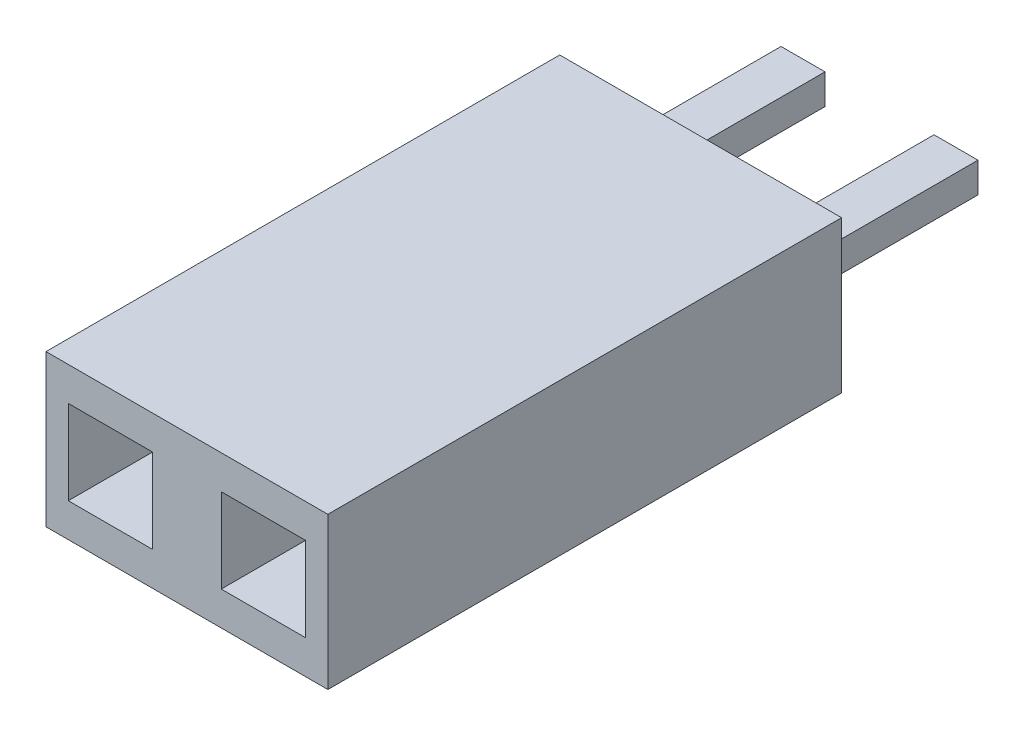
ISO-10303-21;
HEADER;
FILE_DESCRIPTION(('STEP AP214'),'2;1');
FILE_NAME('part.step','',(''),(''),'','','');
FILE_SCHEMA(('AUTOMOTIVE_DESIGN { 1 0 10303 214 1 1 1 1 }'));
ENDSEC;
DATA;
#1=APPLICATION_CONTEXT('core data for automotive mechanical design processes');
#2=APPLICATION_PROTOCOL_DEFINITION('international standard','automotive_design',2000,#1);
#3=PRODUCT_CONTEXT('',#1,'mechanical');
#4=PRODUCT('Part','Part','',(#3));
#5=PRODUCT_RELATED_PRODUCT_CATEGORY('part','',(#4));
#6=PRODUCT_DEFINITION_FORMATION('','',#4);
#7=PRODUCT_DEFINITION_CONTEXT('part definition',#1,'design');
#8=PRODUCT_DEFINITION('design','',#6,#7);
#9=PRODUCT_DEFINITION_SHAPE('','',#8);
#10=(LENGTH_UNIT() NAMED_UNIT(*) SI_UNIT(.MILLI.,.METRE.));
#11=(NAMED_UNIT(*) PLANE_ANGLE_UNIT() SI_UNIT($,.RADIAN.));
#12=(NAMED_UNIT(*) SI_UNIT($,.STERADIAN.) SOLID_ANGLE_UNIT());
#13=UNCERTAINTY_MEASURE_WITH_UNIT(LENGTH_MEASURE(1.E-05),#10,'distance_accuracy_value','');
#14=(GEOMETRIC_REPRESENTATION_CONTEXT(3) GLOBAL_UNCERTAINTY_ASSIGNED_CONTEXT((#13)) GLOBAL_UNIT_ASSIGNED_CONTEXT((#10,
#11,#12)) REPRESENTATION_CONTEXT('',''));
#15=CARTESIAN_POINT('',(0.,0.,0.));
#16=DIRECTION('',(0.,0.,1.));
#17=DIRECTION('',(1.,0.,0.));
#18=AXIS2_PLACEMENT_3D('',#15,#16,#17);
#19=CARTESIAN_POINT('',(-5.34952853598015,-1.31761786600496,8.53));
#20=DIRECTION('',(1.,0.,0.));
#21=DIRECTION('',(0.,0.,-1.));
#22=AXIS2_PLACEMENT_3D('',#19,#20,#21);
#23=PLANE('',#22);
#24=DIRECTION('',(0.,-1.,0.));
#25=VECTOR('',#24,1.);
#26=CARTESIAN_POINT('',(-5.34952853598015,-1.31761786600496,0.));
#27=LINE('',#26,#25);
#28=CARTESIAN_POINT('',(-5.34952853598015,1.20238213399504,0.));
#29=VERTEX_POINT('',#28);
#30=CARTESIAN_POINT('',(-5.34952853598015,-1.31761786600496,0.));
#31=VERTEX_POINT('',#30);
#32=EDGE_CURVE('E284',#29,#31,#27,.T.);
#33=ORIENTED_EDGE('',*,*,#32,.T.);
#34=DIRECTION('',(0.,0.,-1.));
#35=VECTOR('',#34,1.);
#36=CARTESIAN_POINT('',(-5.34952853598015,-1.31761786600496,8.53));
#37=LINE('',#36,#35);
#38=CARTESIAN_POINT('',(-5.34952853598015,-1.31761786600496,8.53));
#39=VERTEX_POINT('',#38);
#40=EDGE_CURVE('E317',#39,#31,#37,.T.);
#41=ORIENTED_EDGE('',*,*,#40,.F.);
#42=DIRECTION('',(0.,-1.,0.));
#43=VECTOR('',#42,1.);
#44=CARTESIAN_POINT('',(-5.34952853598015,-1.31761786600496,8.53));
#45=LINE('',#44,#43);
#46=CARTESIAN_POINT('',(-5.34952853598015,1.20238213399504,8.53));
#47=VERTEX_POINT('',#46);
#48=EDGE_CURVE('E291',#47,#39,#45,.T.);
#49=ORIENTED_EDGE('',*,*,#48,.F.);
#50=DIRECTION('',(0.,0.,-1.));
#51=VECTOR('',#50,1.);
#52=CARTESIAN_POINT('',(-5.34952853598015,1.20238213399504,8.53));
#53=LINE('',#52,#51);
#54=EDGE_CURVE('E301',#47,#29,#53,.T.);
#55=ORIENTED_EDGE('',*,*,#54,.T.);
#56=EDGE_LOOP('',(#33,#41,#49,#55));
#57=FACE_BOUND('',#56,.T.);
#58=ADVANCED_FACE('F36',(#57),#23,.F.);
#59=CARTESIAN_POINT('',(-0.669528535980149,-1.31761786600496,8.53));
#60=DIRECTION('',(0.,1.,0.));
#61=DIRECTION('',(0.,0.,1.));
#62=AXIS2_PLACEMENT_3D('',#59,#60,#61);
#63=PLANE('',#62);
#64=DIRECTION('',(1.,0.,0.));
#65=VECTOR('',#64,1.);
#66=CARTESIAN_POINT('',(-0.669528535980149,-1.31761786600496,0.));
#67=LINE('',#66,#65);
#68=CARTESIAN_POINT('',(-0.669528535980149,-1.31761786600496,0.));
#69=VERTEX_POINT('',#68);
#70=EDGE_CURVE('E304',#31,#69,#67,.T.);
#71=ORIENTED_EDGE('',*,*,#70,.T.);
#72=DIRECTION('',(0.,0.,-1.));
#73=VECTOR('',#72,1.);
#74=CARTESIAN_POINT('',(-0.669528535980149,-1.31761786600496,8.53));
#75=LINE('',#74,#73);
#76=CARTESIAN_POINT('',(-0.669528535980149,-1.31761786600496,8.53));
#77=VERTEX_POINT('',#76);
#78=EDGE_CURVE('E314',#77,#69,#75,.T.);
#79=ORIENTED_EDGE('',*,*,#78,.F.);
#80=DIRECTION('',(1.,0.,0.));
#81=VECTOR('',#80,1.);
#82=CARTESIAN_POINT('',(-0.669528535980149,-1.31761786600496,8.53));
#83=LINE('',#82,#81);
#84=EDGE_CURVE('E294',#39,#77,#83,.T.);
#85=ORIENTED_EDGE('',*,*,#84,.F.);
#86=ORIENTED_EDGE('',*,*,#40,.T.);
#87=EDGE_LOOP('',(#71,#79,#85,#86));
#88=FACE_BOUND('',#87,.T.);
#89=ADVANCED_FACE('F346',(#88),#63,.F.);
#90=CARTESIAN_POINT('',(-0.669528535980149,1.20238213399504,8.53));
#91=DIRECTION('',(-1.,0.,0.));
#92=DIRECTION('',(0.,0.,1.));
#93=AXIS2_PLACEMENT_3D('',#90,#91,#92);
#94=PLANE('',#93);
#95=DIRECTION('',(0.,1.,0.));
#96=VECTOR('',#95,1.);
#97=CARTESIAN_POINT('',(-0.669528535980149,1.20238213399504,0.));
#98=LINE('',#97,#96);
#99=CARTESIAN_POINT('',(-0.669528535980149,1.20238213399504,0.));
#100=VERTEX_POINT('',#99);
#101=EDGE_CURVE('E306',#69,#100,#98,.T.);
#102=ORIENTED_EDGE('',*,*,#101,.T.);
#103=DIRECTION('',(0.,0.,-1.));
#104=VECTOR('',#103,1.);
#105=CARTESIAN_POINT('',(-0.669528535980149,1.20238213399504,8.53));
#106=LINE('',#105,#104);
#107=CARTESIAN_POINT('',(-0.669528535980149,1.20238213399504,8.53));
#108=VERTEX_POINT('',#107);
#109=EDGE_CURVE('E311',#108,#100,#106,.T.);
#110=ORIENTED_EDGE('',*,*,#109,.F.);
#111=DIRECTION('',(0.,1.,0.));
#112=VECTOR('',#111,1.);
#113=CARTESIAN_POINT('',(-0.669528535980149,1.20238213399504,8.53));
#114=LINE('',#113,#112);
#115=EDGE_CURVE('E297',#77,#108,#114,.T.);
#116=ORIENTED_EDGE('',*,*,#115,.F.);
#117=ORIENTED_EDGE('',*,*,#78,.T.);
#118=EDGE_LOOP('',(#102,#110,#116,#117));
#119=FACE_BOUND('',#118,.T.);
#120=ADVANCED_FACE('F351',(#119),#94,.F.);
#121=CARTESIAN_POINT('',(-5.34952853598015,1.20238213399504,8.53));
#122=DIRECTION('',(0.,-1.,0.));
#123=DIRECTION('',(0.,0.,-1.));
#124=AXIS2_PLACEMENT_3D('',#121,#122,#123);
#125=PLANE('',#124);
#126=DIRECTION('',(-1.,0.,0.));
#127=VECTOR('',#126,1.);
#128=CARTESIAN_POINT('',(-5.34952853598015,1.20238213399504,0.));
#129=LINE('',#128,#127);
#130=EDGE_CURVE('E295',#100,#29,#129,.T.);
#131=ORIENTED_EDGE('',*,*,#130,.T.);
#132=ORIENTED_EDGE('',*,*,#54,.F.);
#133=DIRECTION('',(-1.,0.,0.));
#134=VECTOR('',#133,1.);
#135=CARTESIAN_POINT('',(-5.34952853598015,1.20238213399504,8.53));
#136=LINE('',#135,#134);
#137=EDGE_CURVE('E299',#108,#47,#136,.T.);
#138=ORIENTED_EDGE('',*,*,#137,.F.);
#139=ORIENTED_EDGE('',*,*,#109,.T.);
#140=EDGE_LOOP('',(#131,#132,#138,#139));
#141=FACE_BOUND('',#140,.T.);
#142=ADVANCED_FACE('F368',(#141),#125,.F.);
#143=CARTESIAN_POINT('',(0.,0.,8.53));
#144=DIRECTION('',(0.,0.,-1.));
#145=DIRECTION('',(-1.,0.,0.));
#146=AXIS2_PLACEMENT_3D('',#143,#144,#145);
#147=PLANE('',#146);
#148=DIRECTION('',(1.,0.,0.));
#149=VECTOR('',#148,1.);
#150=CARTESIAN_POINT('',(-3.57952853598015,-0.757617866004965,8.53));
#151=LINE('',#150,#149);
#152=CARTESIAN_POINT('',(-4.97952853598015,-0.757617866004965,8.53));
#153=VERTEX_POINT('',#152);
#154=CARTESIAN_POINT('',(-3.57952853598015,-0.757617866004965,8.53));
#155=VERTEX_POINT('',#154);
#156=EDGE_CURVE('E242',#153,#155,#151,.T.);
#157=ORIENTED_EDGE('',*,*,#156,.F.);
#158=DIRECTION('',(0.,-1.,0.));
#159=VECTOR('',#158,1.);
#160=CARTESIAN_POINT('',(-4.97952853598015,-0.757617866004965,8.53));
#161=LINE('',#160,#159);
#162=CARTESIAN_POINT('',(-4.97952853598015,0.642382133995035,8.53));
#163=VERTEX_POINT('',#162);
#164=EDGE_CURVE('E218',#163,#153,#161,.T.);
#165=ORIENTED_EDGE('',*,*,#164,.F.);
#166=DIRECTION('',(-1.,0.,0.));
#167=VECTOR('',#166,1.);
#168=CARTESIAN_POINT('',(-3.57952853598015,0.642382133995035,8.53));
#169=LINE('',#168,#167);
#170=CARTESIAN_POINT('',(-3.57952853598015,0.642382133995035,8.53));
#171=VERTEX_POINT('',#170);
#172=EDGE_CURVE('E231',#171,#163,#169,.T.);
#173=ORIENTED_EDGE('',*,*,#172,.F.);
#174=DIRECTION('',(0.,1.,0.));
#175=VECTOR('',#174,1.);
#176=CARTESIAN_POINT('',(-3.57952853598015,-0.757617866004965,8.53));
#177=LINE('',#176,#175);
#178=EDGE_CURVE('E245',#155,#171,#177,.T.);
#179=ORIENTED_EDGE('',*,*,#178,.F.);
#180=EDGE_LOOP('',(#157,#165,#173,#179));
#181=FACE_BOUND('',#180,.T.);
#182=DIRECTION('',(1.,0.,0.));
#183=VECTOR('',#182,1.);
#184=CARTESIAN_POINT('',(-1.03952853598015,-0.757617866004965,8.53));
#185=LINE('',#184,#183);
#186=CARTESIAN_POINT('',(-2.43952853598015,-0.757617866004965,8.53));
#187=VERTEX_POINT('',#186);
#188=CARTESIAN_POINT('',(-1.03952853598015,-0.757617866004965,8.53));
#189=VERTEX_POINT('',#188);
#190=EDGE_CURVE('E274',#187,#189,#185,.T.);
#191=ORIENTED_EDGE('',*,*,#190,.F.);
#192=DIRECTION('',(0.,-1.,0.));
#193=VECTOR('',#192,1.);
#194=CARTESIAN_POINT('',(-2.43952853598015,-0.757617866004965,8.53));
#195=LINE('',#194,#193);
#196=CARTESIAN_POINT('',(-2.43952853598015,0.642382133995035,8.53));
#197=VERTEX_POINT('',#196);
#198=EDGE_CURVE('E252',#197,#187,#195,.T.);
#199=ORIENTED_EDGE('',*,*,#198,.F.);
#200=DIRECTION('',(-1.,0.,0.));
#201=VECTOR('',#200,1.);
#202=CARTESIAN_POINT('',(-1.03952853598015,0.642382133995035,8.53));
#203=LINE('',#202,#201);
#204=CARTESIAN_POINT('',(-1.03952853598015,0.642382133995035,8.53));
#205=VERTEX_POINT('',#204);
#206=EDGE_CURVE('E263',#205,#197,#203,.T.);
#207=ORIENTED_EDGE('',*,*,#206,.F.);
#208=DIRECTION('',(0.,1.,0.));
#209=VECTOR('',#208,1.);
#210=CARTESIAN_POINT('',(-1.03952853598015,-0.757617866004965,8.53));
#211=LINE('',#210,#209);
#212=EDGE_CURVE('E277',#189,#205,#211,.T.);
#213=ORIENTED_EDGE('',*,*,#212,.F.);
#214=EDGE_LOOP('',(#191,#199,#207,#213));
#215=FACE_BOUND('',#214,.T.);
#216=ORIENTED_EDGE('',*,*,#48,.T.);
#217=ORIENTED_EDGE('',*,*,#84,.T.);
#218=ORIENTED_EDGE('',*,*,#115,.T.);
#219=ORIENTED_EDGE('',*,*,#137,.T.);
#220=EDGE_LOOP('',(#216,#217,#218,#219));
#221=FACE_BOUND('',#220,.T.);
#222=ADVANCED_FACE('F364',(#181,#215,#221),#147,.F.);
#223=CARTESIAN_POINT('',(0.,0.,0.));
#224=DIRECTION('',(0.,0.,-1.));
#225=DIRECTION('',(-1.,0.,0.));
#226=AXIS2_PLACEMENT_3D('',#223,#224,#225);
#227=PLANE('',#226);
#228=DIRECTION('',(0.,1.,0.));
#229=VECTOR('',#228,1.);
#230=CARTESIAN_POINT('',(-4.64452853598015,0.,0.));
#231=LINE('',#230,#229);
#232=CARTESIAN_POINT('',(-4.64452853598015,-0.307617866004965,0.));
#233=VERTEX_POINT('',#232);
#234=CARTESIAN_POINT('',(-4.64452853598015,0.192382133995035,0.));
#235=VERTEX_POINT('',#234);
#236=EDGE_CURVE('E11',#233,#235,#231,.T.);
#237=ORIENTED_EDGE('',*,*,#236,.F.);
#238=DIRECTION('',(-1.,0.,0.));
#239=VECTOR('',#238,1.);
#240=CARTESIAN_POINT('',(0.,-0.307617866004964,0.));
#241=LINE('',#240,#239);
#242=CARTESIAN_POINT('',(-3.91452853598015,-0.307617866004964,0.));
#243=VERTEX_POINT('',#242);
#244=EDGE_CURVE('E174',#243,#233,#241,.T.);
#245=ORIENTED_EDGE('',*,*,#244,.F.);
#246=DIRECTION('',(0.,-1.,0.));
#247=VECTOR('',#246,1.);
#248=CARTESIAN_POINT('',(-3.91452853598015,0.,0.));
#249=LINE('',#248,#247);
#250=CARTESIAN_POINT('',(-3.91452853598015,0.192382133995036,0.));
#251=VERTEX_POINT('',#250);
#252=EDGE_CURVE('E53',#251,#243,#249,.T.);
#253=ORIENTED_EDGE('',*,*,#252,.F.);
#254=DIRECTION('',(1.,0.,0.));
#255=VECTOR('',#254,1.);
#256=CARTESIAN_POINT('',(0.,0.192382133995036,0.));
#257=LINE('',#256,#255);
#258=EDGE_CURVE('E43',#235,#251,#257,.T.);
#259=ORIENTED_EDGE('',*,*,#258,.F.);
#260=EDGE_LOOP('',(#237,#245,#253,#259));
#261=FACE_BOUND('',#260,.T.);
#262=DIRECTION('',(0.,1.,0.));
#263=VECTOR('',#262,1.);
#264=CARTESIAN_POINT('',(-2.10452853598015,0.,0.));
#265=LINE('',#264,#263);
#266=CARTESIAN_POINT('',(-2.10452853598015,-0.307617866004965,0.));
#267=VERTEX_POINT('',#266);
#268=CARTESIAN_POINT('',(-2.10452853598015,0.192382133995035,0.));
#269=VERTEX_POINT('',#268);
#270=EDGE_CURVE('E329',#267,#269,#265,.T.);
#271=ORIENTED_EDGE('',*,*,#270,.F.);
#272=DIRECTION('',(-1.,0.,0.));
#273=VECTOR('',#272,1.);
#274=CARTESIAN_POINT('',(0.,-0.307617866004964,0.));
#275=LINE('',#274,#273);
#276=CARTESIAN_POINT('',(-1.37452853598015,-0.307617866004964,0.));
#277=VERTEX_POINT('',#276);
#278=EDGE_CURVE('E320',#277,#267,#275,.T.);
#279=ORIENTED_EDGE('',*,*,#278,.F.);
#280=DIRECTION('',(0.,-1.,0.));
#281=VECTOR('',#280,1.);
#282=CARTESIAN_POINT('',(-1.37452853598015,0.,0.));
#283=LINE('',#282,#281);
#284=CARTESIAN_POINT('',(-1.37452853598015,0.192382133995036,0.));
#285=VERTEX_POINT('',#284);
#286=EDGE_CURVE('E323',#285,#277,#283,.T.);
#287=ORIENTED_EDGE('',*,*,#286,.F.);
#288=DIRECTION('',(1.,0.,0.));
#289=VECTOR('',#288,1.);
#290=CARTESIAN_POINT('',(0.,0.192382133995036,0.));
#291=LINE('',#290,#289);
#292=EDGE_CURVE('E326',#269,#285,#291,.T.);
#293=ORIENTED_EDGE('',*,*,#292,.F.);
#294=EDGE_LOOP('',(#271,#279,#287,#293));
#295=FACE_BOUND('',#294,.T.);
#296=ORIENTED_EDGE('',*,*,#32,.F.);
#297=ORIENTED_EDGE('',*,*,#130,.F.);
#298=ORIENTED_EDGE('',*,*,#101,.F.);
#299=ORIENTED_EDGE('',*,*,#70,.F.);
#300=EDGE_LOOP('',(#296,#297,#298,#299));
#301=FACE_BOUND('',#300,.T.);
#302=ADVANCED_FACE('F359',(#261,#295,#301),#227,.T.);
#303=CARTESIAN_POINT('',(-2.43952853598015,-0.757617866004965,0.529999999999999));
#304=DIRECTION('',(-1.,0.,0.));
#305=DIRECTION('',(0.,0.,1.));
#306=AXIS2_PLACEMENT_3D('',#303,#304,#305);
#307=PLANE('',#306);
#308=ORIENTED_EDGE('',*,*,#198,.T.);
#309=DIRECTION('',(0.,0.,1.));
#310=VECTOR('',#309,1.);
#311=CARTESIAN_POINT('',(-2.43952853598015,-0.757617866004965,0.529999999999999));
#312=LINE('',#311,#310);
#313=CARTESIAN_POINT('',(-2.43952853598015,-0.757617866004965,0.529999999999999));
#314=VERTEX_POINT('',#313);
#315=EDGE_CURVE('E272',#314,#187,#312,.T.);
#316=ORIENTED_EDGE('',*,*,#315,.F.);
#317=DIRECTION('',(0.,-1.,0.));
#318=VECTOR('',#317,1.);
#319=CARTESIAN_POINT('',(-2.43952853598015,-0.757617866004965,0.529999999999999));
#320=LINE('',#319,#318);
#321=CARTESIAN_POINT('',(-2.43952853598015,0.642382133995035,0.529999999999999));
#322=VERTEX_POINT('',#321);
#323=EDGE_CURVE('E259',#322,#314,#320,.T.);
#324=ORIENTED_EDGE('',*,*,#323,.F.);
#325=DIRECTION('',(0.,0.,1.));
#326=VECTOR('',#325,1.);
#327=CARTESIAN_POINT('',(-2.43952853598015,0.642382133995035,0.529999999999999));
#328=LINE('',#327,#326);
#329=EDGE_CURVE('E282',#322,#197,#328,.T.);
#330=ORIENTED_EDGE('',*,*,#329,.T.);
#331=EDGE_LOOP('',(#308,#316,#324,#330));
#332=FACE_BOUND('',#331,.T.);
#333=ADVANCED_FACE('F379',(#332),#307,.F.);
#334=CARTESIAN_POINT('',(-1.03952853598015,0.642382133995035,0.529999999999999));
#335=DIRECTION('',(0.,1.,0.));
#336=DIRECTION('',(0.,0.,1.));
#337=AXIS2_PLACEMENT_3D('',#334,#335,#336);
#338=PLANE('',#337);
#339=ORIENTED_EDGE('',*,*,#206,.T.);
#340=ORIENTED_EDGE('',*,*,#329,.F.);
#341=DIRECTION('',(-1.,0.,0.));
#342=VECTOR('',#341,1.);
#343=CARTESIAN_POINT('',(-1.03952853598015,0.642382133995035,0.529999999999999));
#344=LINE('',#343,#342);
#345=CARTESIAN_POINT('',(-1.03952853598015,0.642382133995035,0.529999999999999));
#346=VERTEX_POINT('',#345);
#347=EDGE_CURVE('E269',#346,#322,#344,.T.);
#348=ORIENTED_EDGE('',*,*,#347,.F.);
#349=DIRECTION('',(0.,0.,1.));
#350=VECTOR('',#349,1.);
#351=CARTESIAN_POINT('',(-1.03952853598015,0.642382133995035,0.529999999999999));
#352=LINE('',#351,#350);
#353=EDGE_CURVE('E285',#346,#205,#352,.T.);
#354=ORIENTED_EDGE('',*,*,#353,.T.);
#355=EDGE_LOOP('',(#339,#340,#348,#354));
#356=FACE_BOUND('',#355,.T.);
#357=ADVANCED_FACE('F385',(#356),#338,.F.);
#358=CARTESIAN_POINT('',(-1.03952853598015,-0.757617866004965,0.529999999999999));
#359=DIRECTION('',(1.,0.,0.));
#360=DIRECTION('',(0.,0.,-1.));
#361=AXIS2_PLACEMENT_3D('',#358,#359,#360);
#362=PLANE('',#361);
#363=ORIENTED_EDGE('',*,*,#212,.T.);
#364=ORIENTED_EDGE('',*,*,#353,.F.);
#365=DIRECTION('',(0.,1.,0.));
#366=VECTOR('',#365,1.);
#367=CARTESIAN_POINT('',(-1.03952853598015,-0.757617866004965,0.529999999999999));
#368=LINE('',#367,#366);
#369=CARTESIAN_POINT('',(-1.03952853598015,-0.757617866004965,0.529999999999999));
#370=VERTEX_POINT('',#369);
#371=EDGE_CURVE('E266',#370,#346,#368,.T.);
#372=ORIENTED_EDGE('',*,*,#371,.F.);
#373=DIRECTION('',(0.,0.,1.));
#374=VECTOR('',#373,1.);
#375=CARTESIAN_POINT('',(-1.03952853598015,-0.757617866004965,0.529999999999999));
#376=LINE('',#375,#374);
#377=EDGE_CURVE('E287',#370,#189,#376,.T.);
#378=ORIENTED_EDGE('',*,*,#377,.T.);
#379=EDGE_LOOP('',(#363,#364,#372,#378));
#380=FACE_BOUND('',#379,.T.);
#381=ADVANCED_FACE('F391',(#380),#362,.F.);
#382=CARTESIAN_POINT('',(-1.03952853598015,-0.757617866004965,0.529999999999999));
#383=DIRECTION('',(0.,-1.,0.));
#384=DIRECTION('',(1.,0.,0.));
#385=AXIS2_PLACEMENT_3D('',#382,#383,#384);
#386=PLANE('',#385);
#387=ORIENTED_EDGE('',*,*,#190,.T.);
#388=ORIENTED_EDGE('',*,*,#377,.F.);
#389=DIRECTION('',(1.,0.,0.));
#390=VECTOR('',#389,1.);
#391=CARTESIAN_POINT('',(-1.03952853598015,-0.757617866004965,0.529999999999999));
#392=LINE('',#391,#390);
#393=EDGE_CURVE('E262',#314,#370,#392,.T.);
#394=ORIENTED_EDGE('',*,*,#393,.F.);
#395=ORIENTED_EDGE('',*,*,#315,.T.);
#396=EDGE_LOOP('',(#387,#388,#394,#395));
#397=FACE_BOUND('',#396,.T.);
#398=ADVANCED_FACE('F387',(#397),#386,.F.);
#399=CARTESIAN_POINT('',(0.,0.,0.529999999999999));
#400=DIRECTION('',(0.,0.,1.));
#401=DIRECTION('',(1.,0.,0.));
#402=AXIS2_PLACEMENT_3D('',#399,#400,#401);
#403=PLANE('',#402);
#404=ORIENTED_EDGE('',*,*,#323,.T.);
#405=ORIENTED_EDGE('',*,*,#393,.T.);
#406=ORIENTED_EDGE('',*,*,#371,.T.);
#407=ORIENTED_EDGE('',*,*,#347,.T.);
#408=EDGE_LOOP('',(#404,#405,#406,#407));
#409=FACE_BOUND('',#408,.T.);
#410=ADVANCED_FACE('F390',(#409),#403,.T.);
#411=CARTESIAN_POINT('',(-4.97952853598015,-0.757617866004965,0.529999999999999));
#412=DIRECTION('',(-1.,0.,0.));
#413=DIRECTION('',(0.,0.,1.));
#414=AXIS2_PLACEMENT_3D('',#411,#412,#413);
#415=PLANE('',#414);
#416=ORIENTED_EDGE('',*,*,#164,.T.);
#417=DIRECTION('',(0.,0.,1.));
#418=VECTOR('',#417,1.);
#419=CARTESIAN_POINT('',(-4.97952853598015,-0.757617866004965,0.529999999999999));
#420=LINE('',#419,#418);
#421=CARTESIAN_POINT('',(-4.97952853598015,-0.757617866004965,0.529999999999999));
#422=VERTEX_POINT('',#421);
#423=EDGE_CURVE('E240',#422,#153,#420,.T.);
#424=ORIENTED_EDGE('',*,*,#423,.F.);
#425=DIRECTION('',(0.,-1.,0.));
#426=VECTOR('',#425,1.);
#427=CARTESIAN_POINT('',(-4.97952853598015,-0.757617866004965,0.529999999999999));
#428=LINE('',#427,#426);
#429=CARTESIAN_POINT('',(-4.97952853598015,0.642382133995035,0.529999999999999));
#430=VERTEX_POINT('',#429);
#431=EDGE_CURVE('E227',#430,#422,#428,.T.);
#432=ORIENTED_EDGE('',*,*,#431,.F.);
#433=DIRECTION('',(0.,0.,1.));
#434=VECTOR('',#433,1.);
#435=CARTESIAN_POINT('',(-4.97952853598015,0.642382133995035,0.529999999999999));
#436=LINE('',#435,#434);
#437=EDGE_CURVE('E250',#430,#163,#436,.T.);
#438=ORIENTED_EDGE('',*,*,#437,.T.);
#439=EDGE_LOOP('',(#416,#424,#432,#438));
#440=FACE_BOUND('',#439,.T.);
#441=ADVANCED_FACE('F401',(#440),#415,.F.);
#442=CARTESIAN_POINT('',(-3.57952853598015,0.642382133995035,0.529999999999999));
#443=DIRECTION('',(0.,1.,0.));
#444=DIRECTION('',(0.,0.,1.));
#445=AXIS2_PLACEMENT_3D('',#442,#443,#444);
#446=PLANE('',#445);
#447=ORIENTED_EDGE('',*,*,#172,.T.);
#448=ORIENTED_EDGE('',*,*,#437,.F.);
#449=DIRECTION('',(-1.,0.,0.));
#450=VECTOR('',#449,1.);
#451=CARTESIAN_POINT('',(-3.57952853598015,0.642382133995035,0.529999999999999));
#452=LINE('',#451,#450);
#453=CARTESIAN_POINT('',(-3.57952853598015,0.642382133995035,0.529999999999999));
#454=VERTEX_POINT('',#453);
#455=EDGE_CURVE('E237',#454,#430,#452,.T.);
#456=ORIENTED_EDGE('',*,*,#455,.F.);
#457=DIRECTION('',(0.,0.,1.));
#458=VECTOR('',#457,1.);
#459=CARTESIAN_POINT('',(-3.57952853598015,0.642382133995035,0.529999999999999));
#460=LINE('',#459,#458);
#461=EDGE_CURVE('E253',#454,#171,#460,.T.);
#462=ORIENTED_EDGE('',*,*,#461,.T.);
#463=EDGE_LOOP('',(#447,#448,#456,#462));
#464=FACE_BOUND('',#463,.T.);
#465=ADVANCED_FACE('F405',(#464),#446,.F.);
#466=CARTESIAN_POINT('',(-3.57952853598015,-0.757617866004965,0.529999999999999));
#467=DIRECTION('',(1.,0.,0.));
#468=DIRECTION('',(0.,0.,-1.));
#469=AXIS2_PLACEMENT_3D('',#466,#467,#468);
#470=PLANE('',#469);
#471=ORIENTED_EDGE('',*,*,#178,.T.);
#472=ORIENTED_EDGE('',*,*,#461,.F.);
#473=DIRECTION('',(0.,1.,0.));
#474=VECTOR('',#473,1.);
#475=CARTESIAN_POINT('',(-3.57952853598015,-0.757617866004965,0.529999999999999));
#476=LINE('',#475,#474);
#477=CARTESIAN_POINT('',(-3.57952853598015,-0.757617866004965,0.529999999999999));
#478=VERTEX_POINT('',#477);
#479=EDGE_CURVE('E234',#478,#454,#476,.T.);
#480=ORIENTED_EDGE('',*,*,#479,.F.);
#481=DIRECTION('',(0.,0.,1.));
#482=VECTOR('',#481,1.);
#483=CARTESIAN_POINT('',(-3.57952853598015,-0.757617866004965,0.529999999999999));
#484=LINE('',#483,#482);
#485=EDGE_CURVE('E255',#478,#155,#484,.T.);
#486=ORIENTED_EDGE('',*,*,#485,.T.);
#487=EDGE_LOOP('',(#471,#472,#480,#486));
#488=FACE_BOUND('',#487,.T.);
#489=ADVANCED_FACE('F411',(#488),#470,.F.);
#490=CARTESIAN_POINT('',(-3.57952853598015,-0.757617866004965,0.529999999999999));
#491=DIRECTION('',(0.,-1.,0.));
#492=DIRECTION('',(1.,0.,0.));
#493=AXIS2_PLACEMENT_3D('',#490,#491,#492);
#494=PLANE('',#493);
#495=ORIENTED_EDGE('',*,*,#156,.T.);
#496=ORIENTED_EDGE('',*,*,#485,.F.);
#497=DIRECTION('',(1.,0.,0.));
#498=VECTOR('',#497,1.);
#499=CARTESIAN_POINT('',(-3.57952853598015,-0.757617866004965,0.529999999999999));
#500=LINE('',#499,#498);
#501=EDGE_CURVE('E230',#422,#478,#500,.T.);
#502=ORIENTED_EDGE('',*,*,#501,.F.);
#503=ORIENTED_EDGE('',*,*,#423,.T.);
#504=EDGE_LOOP('',(#495,#496,#502,#503));
#505=FACE_BOUND('',#504,.T.);
#506=ADVANCED_FACE('F407',(#505),#494,.F.);
#507=CARTESIAN_POINT('',(-2.54,0.,0.529999999999999));
#508=DIRECTION('',(0.,0.,1.));
#509=DIRECTION('',(1.,0.,0.));
#510=AXIS2_PLACEMENT_3D('',#507,#508,#509);
#511=PLANE('',#510);
#512=ORIENTED_EDGE('',*,*,#431,.T.);
#513=ORIENTED_EDGE('',*,*,#501,.T.);
#514=ORIENTED_EDGE('',*,*,#479,.T.);
#515=ORIENTED_EDGE('',*,*,#455,.T.);
#516=EDGE_LOOP('',(#512,#513,#514,#515));
#517=FACE_BOUND('',#516,.T.);
#518=ADVANCED_FACE('F410',(#517),#511,.T.);
#519=CARTESIAN_POINT('',(-2.10452853598015,-0.307617866004965,-2.97));
#520=DIRECTION('',(-1.,0.,0.));
#521=DIRECTION('',(0.,0.,1.));
#522=AXIS2_PLACEMENT_3D('',#519,#520,#521);
#523=PLANE('',#522);
#524=DIRECTION('',(0.,0.,1.));
#525=VECTOR('',#524,1.);
#526=CARTESIAN_POINT('',(-2.10452853598015,-0.307617866004965,-2.97));
#527=LINE('',#526,#525);
#528=CARTESIAN_POINT('',(-2.10452853598015,-0.307617866004965,-2.97));
#529=VERTEX_POINT('',#528);
#530=EDGE_CURVE('E214',#529,#267,#527,.T.);
#531=ORIENTED_EDGE('',*,*,#530,.T.);
#532=ORIENTED_EDGE('',*,*,#270,.T.);
#533=DIRECTION('',(0.,0.,1.));
#534=VECTOR('',#533,1.);
#535=CARTESIAN_POINT('',(-2.10452853598015,0.192382133995035,-2.97));
#536=LINE('',#535,#534);
#537=CARTESIAN_POINT('',(-2.10452853598015,0.192382133995035,-2.97));
#538=VERTEX_POINT('',#537);
#539=EDGE_CURVE('E215',#538,#269,#536,.T.);
#540=ORIENTED_EDGE('',*,*,#539,.F.);
#541=DIRECTION('',(0.,-1.,0.));
#542=VECTOR('',#541,1.);
#543=CARTESIAN_POINT('',(-2.10452853598015,-0.307617866004965,-2.97));
#544=LINE('',#543,#542);
#545=EDGE_CURVE('E198',#538,#529,#544,.T.);
#546=ORIENTED_EDGE('',*,*,#545,.T.);
#547=EDGE_LOOP('',(#531,#532,#540,#546));
#548=FACE_BOUND('',#547,.T.);
#549=ADVANCED_FACE('F421',(#548),#523,.T.);
#550=CARTESIAN_POINT('',(-1.37452853598015,0.192382133995036,-2.97));
#551=DIRECTION('',(0.,1.,0.));
#552=DIRECTION('',(-1.,0.,0.));
#553=AXIS2_PLACEMENT_3D('',#550,#551,#552);
#554=PLANE('',#553);
#555=ORIENTED_EDGE('',*,*,#539,.T.);
#556=ORIENTED_EDGE('',*,*,#292,.T.);
#557=DIRECTION('',(0.,0.,1.));
#558=VECTOR('',#557,1.);
#559=CARTESIAN_POINT('',(-1.37452853598015,0.192382133995036,-2.97));
#560=LINE('',#559,#558);
#561=CARTESIAN_POINT('',(-1.37452853598015,0.192382133995036,-2.97));
#562=VERTEX_POINT('',#561);
#563=EDGE_CURVE('E219',#562,#285,#560,.T.);
#564=ORIENTED_EDGE('',*,*,#563,.F.);
#565=DIRECTION('',(-1.,0.,0.));
#566=VECTOR('',#565,1.);
#567=CARTESIAN_POINT('',(-1.37452853598015,0.192382133995036,-2.97));
#568=LINE('',#567,#566);
#569=EDGE_CURVE('E211',#562,#538,#568,.T.);
#570=ORIENTED_EDGE('',*,*,#569,.T.);
#571=EDGE_LOOP('',(#555,#556,#564,#570));
#572=FACE_BOUND('',#571,.T.);
#573=ADVANCED_FACE('F425',(#572),#554,.T.);
#574=CARTESIAN_POINT('',(-1.37452853598015,-0.307617866004964,-2.97));
#575=DIRECTION('',(1.,0.,0.));
#576=DIRECTION('',(0.,0.,-1.));
#577=AXIS2_PLACEMENT_3D('',#574,#575,#576);
#578=PLANE('',#577);
#579=ORIENTED_EDGE('',*,*,#563,.T.);
#580=ORIENTED_EDGE('',*,*,#286,.T.);
#581=DIRECTION('',(0.,0.,1.));
#582=VECTOR('',#581,1.);
#583=CARTESIAN_POINT('',(-1.37452853598015,-0.307617866004964,-2.97));
#584=LINE('',#583,#582);
#585=CARTESIAN_POINT('',(-1.37452853598015,-0.307617866004964,-2.97));
#586=VERTEX_POINT('',#585);
#587=EDGE_CURVE('E222',#586,#277,#584,.T.);
#588=ORIENTED_EDGE('',*,*,#587,.F.);
#589=DIRECTION('',(0.,1.,0.));
#590=VECTOR('',#589,1.);
#591=CARTESIAN_POINT('',(-1.37452853598015,-0.307617866004964,-2.97));
#592=LINE('',#591,#590);
#593=EDGE_CURVE('E208',#586,#562,#592,.T.);
#594=ORIENTED_EDGE('',*,*,#593,.T.);
#595=EDGE_LOOP('',(#579,#580,#588,#594));
#596=FACE_BOUND('',#595,.T.);
#597=ADVANCED_FACE('F431',(#596),#578,.T.);
#598=CARTESIAN_POINT('',(-1.37452853598015,-0.307617866004964,-2.97));
#599=DIRECTION('',(0.,-1.,0.));
#600=DIRECTION('',(1.,0.,0.));
#601=AXIS2_PLACEMENT_3D('',#598,#599,#600);
#602=PLANE('',#601);
#603=ORIENTED_EDGE('',*,*,#587,.T.);
#604=ORIENTED_EDGE('',*,*,#278,.T.);
#605=ORIENTED_EDGE('',*,*,#530,.F.);
#606=DIRECTION('',(1.,0.,0.));
#607=VECTOR('',#606,1.);
#608=CARTESIAN_POINT('',(-1.37452853598015,-0.307617866004964,-2.97));
#609=LINE('',#608,#607);
#610=EDGE_CURVE('E205',#529,#586,#609,.T.);
#611=ORIENTED_EDGE('',*,*,#610,.T.);
#612=EDGE_LOOP('',(#603,#604,#605,#611));
#613=FACE_BOUND('',#612,.T.);
#614=ADVANCED_FACE('F427',(#613),#602,.T.);
#615=CARTESIAN_POINT('',(0.,0.,-2.97));
#616=DIRECTION('',(0.,0.,1.));
#617=DIRECTION('',(1.,0.,0.));
#618=AXIS2_PLACEMENT_3D('',#615,#616,#617);
#619=PLANE('',#618);
#620=ORIENTED_EDGE('',*,*,#545,.F.);
#621=ORIENTED_EDGE('',*,*,#569,.F.);
#622=ORIENTED_EDGE('',*,*,#593,.F.);
#623=ORIENTED_EDGE('',*,*,#610,.F.);
#624=EDGE_LOOP('',(#620,#621,#622,#623));
#625=FACE_BOUND('',#624,.T.);
#626=ADVANCED_FACE('F430',(#625),#619,.F.);
#627=CARTESIAN_POINT('',(-4.64452853598015,-0.307617866004965,-2.97));
#628=DIRECTION('',(-1.,0.,0.));
#629=DIRECTION('',(0.,0.,1.));
#630=AXIS2_PLACEMENT_3D('',#627,#628,#629);
#631=PLANE('',#630);
#632=DIRECTION('',(0.,0.,1.));
#633=VECTOR('',#632,1.);
#634=CARTESIAN_POINT('',(-4.64452853598015,-0.307617866004965,-2.97));
#635=LINE('',#634,#633);
#636=CARTESIAN_POINT('',(-4.64452853598015,-0.307617866004965,-2.97));
#637=VERTEX_POINT('',#636);
#638=EDGE_CURVE('E169',#637,#233,#635,.T.);
#639=ORIENTED_EDGE('',*,*,#638,.T.);
#640=ORIENTED_EDGE('',*,*,#236,.T.);
#641=DIRECTION('',(0.,0.,1.));
#642=VECTOR('',#641,1.);
#643=CARTESIAN_POINT('',(-4.64452853598015,0.192382133995035,-2.97));
#644=LINE('',#643,#642);
#645=CARTESIAN_POINT('',(-4.64452853598015,0.192382133995035,-2.97));
#646=VERTEX_POINT('',#645);
#647=EDGE_CURVE('E192',#646,#235,#644,.T.);
#648=ORIENTED_EDGE('',*,*,#647,.F.);
#649=DIRECTION('',(0.,-1.,0.));
#650=VECTOR('',#649,1.);
#651=CARTESIAN_POINT('',(-4.64452853598015,-0.307617866004965,-2.97));
#652=LINE('',#651,#650);
#653=EDGE_CURVE('E185',#646,#637,#652,.T.);
#654=ORIENTED_EDGE('',*,*,#653,.T.);
#655=EDGE_LOOP('',(#639,#640,#648,#654));
#656=FACE_BOUND('',#655,.T.);
#657=ADVANCED_FACE('F190',(#656),#631,.T.);
#658=CARTESIAN_POINT('',(-3.91452853598015,0.192382133995036,-2.97));
#659=DIRECTION('',(0.,1.,0.));
#660=DIRECTION('',(-1.,0.,0.));
#661=AXIS2_PLACEMENT_3D('',#658,#659,#660);
#662=PLANE('',#661);
#663=ORIENTED_EDGE('',*,*,#647,.T.);
#664=ORIENTED_EDGE('',*,*,#258,.T.);
#665=DIRECTION('',(0.,0.,1.));
#666=VECTOR('',#665,1.);
#667=CARTESIAN_POINT('',(-3.91452853598015,0.192382133995036,-2.97));
#668=LINE('',#667,#666);
#669=CARTESIAN_POINT('',(-3.91452853598015,0.192382133995036,-2.97));
#670=VERTEX_POINT('',#669);
#671=EDGE_CURVE('E199',#670,#251,#668,.T.);
#672=ORIENTED_EDGE('',*,*,#671,.F.);
#673=DIRECTION('',(-1.,0.,0.));
#674=VECTOR('',#673,1.);
#675=CARTESIAN_POINT('',(-3.91452853598015,0.192382133995036,-2.97));
#676=LINE('',#675,#674);
#677=EDGE_CURVE('E178',#670,#646,#676,.T.);
#678=ORIENTED_EDGE('',*,*,#677,.T.);
#679=EDGE_LOOP('',(#663,#664,#672,#678));
#680=FACE_BOUND('',#679,.T.);
#681=ADVANCED_FACE('F334',(#680),#662,.T.);
#682=CARTESIAN_POINT('',(-3.91452853598015,-0.307617866004964,-2.97));
#683=DIRECTION('',(1.,0.,0.));
#684=DIRECTION('',(0.,0.,-1.));
#685=AXIS2_PLACEMENT_3D('',#682,#683,#684);
#686=PLANE('',#685);
#687=ORIENTED_EDGE('',*,*,#671,.T.);
#688=ORIENTED_EDGE('',*,*,#252,.T.);
#689=DIRECTION('',(0.,0.,1.));
#690=VECTOR('',#689,1.);
#691=CARTESIAN_POINT('',(-3.91452853598015,-0.307617866004964,-2.97));
#692=LINE('',#691,#690);
#693=CARTESIAN_POINT('',(-3.91452853598015,-0.307617866004964,-2.97));
#694=VERTEX_POINT('',#693);
#695=EDGE_CURVE('E177',#694,#243,#692,.T.);
#696=ORIENTED_EDGE('',*,*,#695,.F.);
#697=DIRECTION('',(0.,1.,0.));
#698=VECTOR('',#697,1.);
#699=CARTESIAN_POINT('',(-3.91452853598015,-0.307617866004964,-2.97));
#700=LINE('',#699,#698);
#701=EDGE_CURVE('E188',#694,#670,#700,.T.);
#702=ORIENTED_EDGE('',*,*,#701,.T.);
#703=EDGE_LOOP('',(#687,#688,#696,#702));
#704=FACE_BOUND('',#703,.T.);
#705=ADVANCED_FACE('F336',(#704),#686,.T.);
#706=CARTESIAN_POINT('',(-3.91452853598015,-0.307617866004964,-2.97));
#707=DIRECTION('',(0.,-1.,0.));
#708=DIRECTION('',(1.,0.,0.));
#709=AXIS2_PLACEMENT_3D('',#706,#707,#708);
#710=PLANE('',#709);
#711=ORIENTED_EDGE('',*,*,#695,.T.);
#712=ORIENTED_EDGE('',*,*,#244,.T.);
#713=ORIENTED_EDGE('',*,*,#638,.F.);
#714=DIRECTION('',(1.,0.,0.));
#715=VECTOR('',#714,1.);
#716=CARTESIAN_POINT('',(-3.91452853598015,-0.307617866004964,-2.97));
#717=LINE('',#716,#715);
#718=EDGE_CURVE('E173',#637,#694,#717,.T.);
#719=ORIENTED_EDGE('',*,*,#718,.T.);
#720=EDGE_LOOP('',(#711,#712,#713,#719));
#721=FACE_BOUND('',#720,.T.);
#722=ADVANCED_FACE('F172',(#721),#710,.T.);
#723=CARTESIAN_POINT('',(-2.54,0.,-2.97));
#724=DIRECTION('',(0.,0.,1.));
#725=DIRECTION('',(1.,0.,0.));
#726=AXIS2_PLACEMENT_3D('',#723,#724,#725);
#727=PLANE('',#726);
#728=ORIENTED_EDGE('',*,*,#653,.F.);
#729=ORIENTED_EDGE('',*,*,#677,.F.);
#730=ORIENTED_EDGE('',*,*,#701,.F.);
#731=ORIENTED_EDGE('',*,*,#718,.F.);
#732=EDGE_LOOP('',(#728,#729,#730,#731));
#733=FACE_BOUND('',#732,.T.);
#734=ADVANCED_FACE('F183',(#733),#727,.F.);
#735=CLOSED_SHELL('',(#58,#89,#120,#142,#222,#302,#333,#357,#381,#398,#410,#441,#465,#489,#506,
#518,#549,#573,#597,#614,#626,#657,#681,#705,#722,#734));
#736=MANIFOLD_SOLID_BREP('B2',#735);
#737=ADVANCED_BREP_SHAPE_REPRESENTATION('',(#18,#736),#14);
#738=SHAPE_DEFINITION_REPRESENTATION(#9,#737);
ENDSEC;
END-ISO-10303-21;
